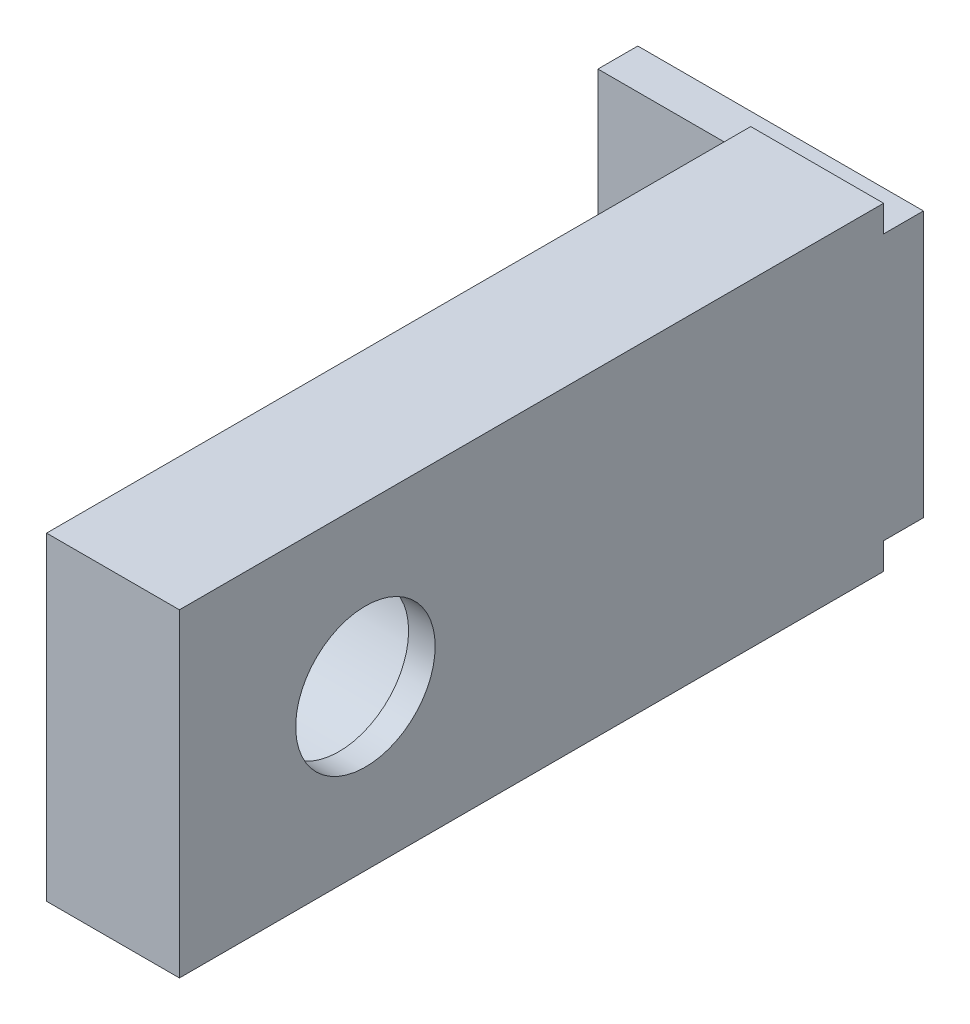
ISO-10303-21;
HEADER;
FILE_DESCRIPTION(('STEP AP214'),'2;1');
FILE_NAME('part.step','',(''),(''),'','','');
FILE_SCHEMA(('AUTOMOTIVE_DESIGN { 1 0 10303 214 1 1 1 1 }'));
ENDSEC;
DATA;
#1=APPLICATION_CONTEXT('core data for automotive mechanical design processes');
#2=APPLICATION_PROTOCOL_DEFINITION('international standard','automotive_design',2000,#1);
#3=PRODUCT_CONTEXT('',#1,'mechanical');
#4=PRODUCT('Part','Part','',(#3));
#5=PRODUCT_RELATED_PRODUCT_CATEGORY('part','',(#4));
#6=PRODUCT_DEFINITION_FORMATION('','',#4);
#7=PRODUCT_DEFINITION_CONTEXT('part definition',#1,'design');
#8=PRODUCT_DEFINITION('design','',#6,#7);
#9=PRODUCT_DEFINITION_SHAPE('','',#8);
#10=(LENGTH_UNIT() NAMED_UNIT(*) SI_UNIT(.MILLI.,.METRE.));
#11=(NAMED_UNIT(*) PLANE_ANGLE_UNIT() SI_UNIT($,.RADIAN.));
#12=(NAMED_UNIT(*) SI_UNIT($,.STERADIAN.) SOLID_ANGLE_UNIT());
#13=UNCERTAINTY_MEASURE_WITH_UNIT(LENGTH_MEASURE(1.E-05),#10,'distance_accuracy_value','');
#14=(GEOMETRIC_REPRESENTATION_CONTEXT(3) GLOBAL_UNCERTAINTY_ASSIGNED_CONTEXT((#13)) GLOBAL_UNIT_ASSIGNED_CONTEXT((#10,
#11,#12)) REPRESENTATION_CONTEXT('',''));
#15=CARTESIAN_POINT('',(0.,0.,0.));
#16=DIRECTION('',(0.,0.,1.));
#17=DIRECTION('',(1.,0.,0.));
#18=AXIS2_PLACEMENT_3D('',#15,#16,#17);
#19=CARTESIAN_POINT('',(31.,44.,64.0019));
#20=DIRECTION('',(1.,0.,0.));
#21=DIRECTION('',(0.,0.,-1.));
#22=AXIS2_PLACEMENT_3D('',#19,#20,#21);
#23=PLANE('',#22);
#24=CARTESIAN_POINT('',(31.,44.,64.0019));
#25=DIRECTION('',(1.,0.,0.));
#26=DIRECTION('',(0.,0.,-1.));
#27=AXIS2_PLACEMENT_3D('',#24,#25,#26);
#28=CIRCLE('',#27,1.5);
#29=CARTESIAN_POINT('',(31.,44.,62.5019));
#30=VERTEX_POINT('',#29);
#31=EDGE_CURVE('E153',#30,#30,#28,.F.);
#32=ORIENTED_EDGE('',*,*,#31,.T.);
#33=EDGE_LOOP('',(#32));
#34=FACE_BOUND('',#33,.T.);
#35=ADVANCED_FACE('F15',(#34),#23,.F.);
#36=CARTESIAN_POINT('',(31.,44.,104.0019));
#37=DIRECTION('',(1.,0.,0.));
#38=DIRECTION('',(0.,0.,-1.));
#39=AXIS2_PLACEMENT_3D('',#36,#37,#38);
#40=PLANE('',#39);
#41=CARTESIAN_POINT('',(31.,44.,104.0019));
#42=DIRECTION('',(1.,0.,0.));
#43=DIRECTION('',(0.,0.,-1.));
#44=AXIS2_PLACEMENT_3D('',#41,#42,#43);
#45=CIRCLE('',#44,1.5);
#46=CARTESIAN_POINT('',(31.,44.,102.5019));
#47=VERTEX_POINT('',#46);
#48=EDGE_CURVE('E150',#47,#47,#45,.F.);
#49=ORIENTED_EDGE('',*,*,#48,.T.);
#50=EDGE_LOOP('',(#49));
#51=FACE_BOUND('',#50,.T.);
#52=ADVANCED_FACE('F391',(#51),#40,.F.);
#53=CARTESIAN_POINT('',(31.,4.,64.0019));
#54=DIRECTION('',(1.,0.,0.));
#55=DIRECTION('',(0.,0.,-1.));
#56=AXIS2_PLACEMENT_3D('',#53,#54,#55);
#57=PLANE('',#56);
#58=CARTESIAN_POINT('',(31.,4.,64.0019));
#59=DIRECTION('',(1.,0.,0.));
#60=DIRECTION('',(0.,0.,-1.));
#61=AXIS2_PLACEMENT_3D('',#58,#59,#60);
#62=CIRCLE('',#61,1.5);
#63=CARTESIAN_POINT('',(31.,4.,62.5019));
#64=VERTEX_POINT('',#63);
#65=EDGE_CURVE('E147',#64,#64,#62,.F.);
#66=ORIENTED_EDGE('',*,*,#65,.T.);
#67=EDGE_LOOP('',(#66));
#68=FACE_BOUND('',#67,.T.);
#69=ADVANCED_FACE('F176',(#68),#57,.F.);
#70=CARTESIAN_POINT('',(31.,4.,104.0019));
#71=DIRECTION('',(1.,0.,0.));
#72=DIRECTION('',(0.,0.,-1.));
#73=AXIS2_PLACEMENT_3D('',#70,#71,#72);
#74=PLANE('',#73);
#75=CARTESIAN_POINT('',(31.,4.,104.0019));
#76=DIRECTION('',(1.,0.,0.));
#77=DIRECTION('',(0.,0.,-1.));
#78=AXIS2_PLACEMENT_3D('',#75,#76,#77);
#79=CIRCLE('',#78,1.5);
#80=CARTESIAN_POINT('',(31.,4.,102.5019));
#81=VERTEX_POINT('',#80);
#82=EDGE_CURVE('E95',#81,#81,#79,.F.);
#83=ORIENTED_EDGE('',*,*,#82,.T.);
#84=EDGE_LOOP('',(#83));
#85=FACE_BOUND('',#84,.T.);
#86=ADVANCED_FACE('F166',(#85),#74,.F.);
#87=CARTESIAN_POINT('',(8.,24.,0.001899999999978));
#88=DIRECTION('',(0.,0.,1.));
#89=DIRECTION('',(1.,0.,0.));
#90=AXIS2_PLACEMENT_3D('',#87,#88,#89);
#91=CYLINDRICAL_SURFACE('',#90,2.75);
#92=CARTESIAN_POINT('',(8.,24.,0.001899999999978));
#93=DIRECTION('',(0.,0.,1.));
#94=DIRECTION('',(1.,0.,0.));
#95=AXIS2_PLACEMENT_3D('',#92,#93,#94);
#96=CIRCLE('',#95,2.75);
#97=CARTESIAN_POINT('',(10.75,24.,0.001899999999978));
#98=VERTEX_POINT('',#97);
#99=EDGE_CURVE('E142',#98,#98,#96,.F.);
#100=ORIENTED_EDGE('',*,*,#99,.T.);
#101=EDGE_LOOP('',(#100));
#102=FACE_BOUND('',#101,.T.);
#103=CARTESIAN_POINT('',(8.,24.,6.0019));
#104=DIRECTION('',(0.,0.,1.));
#105=DIRECTION('',(1.,0.,0.));
#106=AXIS2_PLACEMENT_3D('',#103,#104,#105);
#107=CIRCLE('',#106,2.75);
#108=CARTESIAN_POINT('',(10.75,24.,6.0019));
#109=VERTEX_POINT('',#108);
#110=EDGE_CURVE('E18',#109,#109,#107,.F.);
#111=ORIENTED_EDGE('',*,*,#110,.F.);
#112=EDGE_LOOP('',(#111));
#113=FACE_BOUND('',#112,.T.);
#114=ADVANCED_FACE('F163',(#102,#113),#91,.F.);
#115=CARTESIAN_POINT('',(18.,24.,0.001899999999978));
#116=DIRECTION('',(0.,0.,1.));
#117=DIRECTION('',(1.,0.,0.));
#118=AXIS2_PLACEMENT_3D('',#115,#116,#117);
#119=CYLINDRICAL_SURFACE('',#118,2.75);
#120=CARTESIAN_POINT('',(18.,24.,0.001899999999978));
#121=DIRECTION('',(0.,0.,1.));
#122=DIRECTION('',(1.,0.,0.));
#123=AXIS2_PLACEMENT_3D('',#120,#121,#122);
#124=CIRCLE('',#123,2.75);
#125=CARTESIAN_POINT('',(20.75,24.,0.001899999999978));
#126=VERTEX_POINT('',#125);
#127=EDGE_CURVE('E138',#126,#126,#124,.F.);
#128=ORIENTED_EDGE('',*,*,#127,.T.);
#129=EDGE_LOOP('',(#128));
#130=FACE_BOUND('',#129,.T.);
#131=CARTESIAN_POINT('',(18.,24.,6.0019));
#132=DIRECTION('',(0.,0.,1.));
#133=DIRECTION('',(1.,0.,0.));
#134=AXIS2_PLACEMENT_3D('',#131,#132,#133);
#135=CIRCLE('',#134,2.75);
#136=CARTESIAN_POINT('',(20.75,24.,6.0019));
#137=VERTEX_POINT('',#136);
#138=EDGE_CURVE('E155',#137,#137,#135,.F.);
#139=ORIENTED_EDGE('',*,*,#138,.F.);
#140=EDGE_LOOP('',(#139));
#141=FACE_BOUND('',#140,.T.);
#142=ADVANCED_FACE('F165',(#130,#141),#119,.F.);
#143=CARTESIAN_POINT('',(0.,4.,0.001899999999978));
#144=DIRECTION('',(1.,0.,0.));
#145=DIRECTION('',(0.,0.,-1.));
#146=AXIS2_PLACEMENT_3D('',#143,#144,#145);
#147=PLANE('',#146);
#148=DIRECTION('',(0.,0.,1.));
#149=VECTOR('',#148,1.);
#150=CARTESIAN_POINT('',(0.,44.,0.001899999999978));
#151=LINE('',#150,#149);
#152=CARTESIAN_POINT('',(0.,44.,0.001899999999978));
#153=VERTEX_POINT('',#152);
#154=CARTESIAN_POINT('',(0.,44.,6.0019));
#155=VERTEX_POINT('',#154);
#156=EDGE_CURVE('E457',#153,#155,#151,.T.);
#157=ORIENTED_EDGE('',*,*,#156,.F.);
#158=DIRECTION('',(0.,1.,0.));
#159=VECTOR('',#158,1.);
#160=CARTESIAN_POINT('',(0.,4.,0.001899999999978));
#161=LINE('',#160,#159);
#162=CARTESIAN_POINT('',(0.,4.,0.001899999999978));
#163=VERTEX_POINT('',#162);
#164=EDGE_CURVE('E84',#153,#163,#161,.F.);
#165=ORIENTED_EDGE('',*,*,#164,.T.);
#166=DIRECTION('',(0.,0.,1.));
#167=VECTOR('',#166,1.);
#168=CARTESIAN_POINT('',(0.,4.,0.001899999999978));
#169=LINE('',#168,#167);
#170=CARTESIAN_POINT('',(0.,4.,6.0019));
#171=VERTEX_POINT('',#170);
#172=EDGE_CURVE('E86',#163,#171,#169,.T.);
#173=ORIENTED_EDGE('',*,*,#172,.T.);
#174=DIRECTION('',(0.,1.,0.));
#175=VECTOR('',#174,1.);
#176=CARTESIAN_POINT('',(0.,4.,6.0019));
#177=LINE('',#176,#175);
#178=EDGE_CURVE('E89',#155,#171,#177,.F.);
#179=ORIENTED_EDGE('',*,*,#178,.F.);
#180=EDGE_LOOP('',(#157,#165,#173,#179));
#181=FACE_BOUND('',#180,.T.);
#182=ADVANCED_FACE('F88',(#181),#147,.F.);
#183=CARTESIAN_POINT('',(0.,4.,6.0019));
#184=DIRECTION('',(0.,0.,1.));
#185=DIRECTION('',(1.,0.,0.));
#186=AXIS2_PLACEMENT_3D('',#183,#184,#185);
#187=PLANE('',#186);
#188=ORIENTED_EDGE('',*,*,#138,.T.);
#189=EDGE_LOOP('',(#188));
#190=FACE_BOUND('',#189,.T.);
#191=ORIENTED_EDGE('',*,*,#110,.T.);
#192=EDGE_LOOP('',(#191));
#193=FACE_BOUND('',#192,.T.);
#194=DIRECTION('',(1.,0.,0.));
#195=VECTOR('',#194,1.);
#196=CARTESIAN_POINT('',(0.,4.,6.0019));
#197=LINE('',#196,#195);
#198=CARTESIAN_POINT('',(23.,4.,6.0019));
#199=VERTEX_POINT('',#198);
#200=EDGE_CURVE('E94',#171,#199,#197,.T.);
#201=ORIENTED_EDGE('',*,*,#200,.T.);
#202=DIRECTION('',(0.,1.,0.));
#203=VECTOR('',#202,1.);
#204=CARTESIAN_POINT('',(23.,0.,6.0019));
#205=LINE('',#204,#203);
#206=CARTESIAN_POINT('',(23.,44.,6.0019));
#207=VERTEX_POINT('',#206);
#208=EDGE_CURVE('E137',#199,#207,#205,.T.);
#209=ORIENTED_EDGE('',*,*,#208,.T.);
#210=DIRECTION('',(1.,0.,0.));
#211=VECTOR('',#210,1.);
#212=CARTESIAN_POINT('',(0.,44.,6.0019));
#213=LINE('',#212,#211);
#214=EDGE_CURVE('E101',#155,#207,#213,.T.);
#215=ORIENTED_EDGE('',*,*,#214,.F.);
#216=ORIENTED_EDGE('',*,*,#178,.T.);
#217=EDGE_LOOP('',(#201,#209,#215,#216));
#218=FACE_BOUND('',#217,.T.);
#219=ADVANCED_FACE('F98',(#190,#193,#218),#187,.T.);
#220=CARTESIAN_POINT('',(23.,44.,64.0019));
#221=DIRECTION('',(1.,0.,0.));
#222=DIRECTION('',(0.,0.,-1.));
#223=AXIS2_PLACEMENT_3D('',#220,#221,#222);
#224=CYLINDRICAL_SURFACE('',#223,1.5);
#225=CARTESIAN_POINT('',(23.,44.,64.0019));
#226=DIRECTION('',(1.,0.,0.));
#227=DIRECTION('',(0.,0.,-1.));
#228=AXIS2_PLACEMENT_3D('',#225,#226,#227);
#229=CIRCLE('',#228,1.5);
#230=CARTESIAN_POINT('',(23.,44.,62.5019));
#231=VERTEX_POINT('',#230);
#232=EDGE_CURVE('E134',#231,#231,#229,.F.);
#233=ORIENTED_EDGE('',*,*,#232,.T.);
#234=EDGE_LOOP('',(#233));
#235=FACE_BOUND('',#234,.T.);
#236=ORIENTED_EDGE('',*,*,#31,.F.);
#237=EDGE_LOOP('',(#236));
#238=FACE_BOUND('',#237,.T.);
#239=ADVANCED_FACE('F243',(#235,#238),#224,.F.);
#240=CARTESIAN_POINT('',(23.,44.,104.0019));
#241=DIRECTION('',(1.,0.,0.));
#242=DIRECTION('',(0.,0.,-1.));
#243=AXIS2_PLACEMENT_3D('',#240,#241,#242);
#244=CYLINDRICAL_SURFACE('',#243,1.5);
#245=CARTESIAN_POINT('',(23.,44.,104.0019));
#246=DIRECTION('',(1.,0.,0.));
#247=DIRECTION('',(0.,0.,-1.));
#248=AXIS2_PLACEMENT_3D('',#245,#246,#247);
#249=CIRCLE('',#248,1.5);
#250=CARTESIAN_POINT('',(23.,44.,102.5019));
#251=VERTEX_POINT('',#250);
#252=EDGE_CURVE('E131',#251,#251,#249,.F.);
#253=ORIENTED_EDGE('',*,*,#252,.T.);
#254=EDGE_LOOP('',(#253));
#255=FACE_BOUND('',#254,.T.);
#256=ORIENTED_EDGE('',*,*,#48,.F.);
#257=EDGE_LOOP('',(#256));
#258=FACE_BOUND('',#257,.T.);
#259=ADVANCED_FACE('F239',(#255,#258),#244,.F.);
#260=CARTESIAN_POINT('',(23.,4.,64.0019));
#261=DIRECTION('',(1.,0.,0.));
#262=DIRECTION('',(0.,0.,-1.));
#263=AXIS2_PLACEMENT_3D('',#260,#261,#262);
#264=CYLINDRICAL_SURFACE('',#263,1.5);
#265=CARTESIAN_POINT('',(23.,4.,64.0019));
#266=DIRECTION('',(1.,0.,0.));
#267=DIRECTION('',(0.,0.,-1.));
#268=AXIS2_PLACEMENT_3D('',#265,#266,#267);
#269=CIRCLE('',#268,1.5);
#270=CARTESIAN_POINT('',(23.,4.,62.5019));
#271=VERTEX_POINT('',#270);
#272=EDGE_CURVE('E128',#271,#271,#269,.F.);
#273=ORIENTED_EDGE('',*,*,#272,.T.);
#274=EDGE_LOOP('',(#273));
#275=FACE_BOUND('',#274,.T.);
#276=ORIENTED_EDGE('',*,*,#65,.F.);
#277=EDGE_LOOP('',(#276));
#278=FACE_BOUND('',#277,.T.);
#279=ADVANCED_FACE('F235',(#275,#278),#264,.F.);
#280=CARTESIAN_POINT('',(23.,4.,104.0019));
#281=DIRECTION('',(1.,0.,0.));
#282=DIRECTION('',(0.,0.,-1.));
#283=AXIS2_PLACEMENT_3D('',#280,#281,#282);
#284=CYLINDRICAL_SURFACE('',#283,1.5);
#285=CARTESIAN_POINT('',(23.,4.,104.0019));
#286=DIRECTION('',(1.,0.,0.));
#287=DIRECTION('',(0.,0.,-1.));
#288=AXIS2_PLACEMENT_3D('',#285,#286,#287);
#289=CIRCLE('',#288,1.5);
#290=CARTESIAN_POINT('',(23.,4.,102.5019));
#291=VERTEX_POINT('',#290);
#292=EDGE_CURVE('E122',#291,#291,#289,.F.);
#293=ORIENTED_EDGE('',*,*,#292,.T.);
#294=EDGE_LOOP('',(#293));
#295=FACE_BOUND('',#294,.T.);
#296=ORIENTED_EDGE('',*,*,#82,.F.);
#297=EDGE_LOOP('',(#296));
#298=FACE_BOUND('',#297,.T.);
#299=ADVANCED_FACE('F231',(#295,#298),#284,.F.);
#300=CARTESIAN_POINT('',(23.,24.,84.0019));
#301=DIRECTION('',(1.,0.,0.));
#302=DIRECTION('',(0.,0.,-1.));
#303=AXIS2_PLACEMENT_3D('',#300,#301,#302);
#304=CYLINDRICAL_SURFACE('',#303,17.5);
#305=CARTESIAN_POINT('',(23.,24.,84.0019));
#306=DIRECTION('',(1.,0.,0.));
#307=DIRECTION('',(0.,0.,-1.));
#308=AXIS2_PLACEMENT_3D('',#305,#306,#307);
#309=CIRCLE('',#308,17.5);
#310=CARTESIAN_POINT('',(23.,24.,66.5019));
#311=VERTEX_POINT('',#310);
#312=EDGE_CURVE('E125',#311,#311,#309,.F.);
#313=ORIENTED_EDGE('',*,*,#312,.T.);
#314=EDGE_LOOP('',(#313));
#315=FACE_BOUND('',#314,.T.);
#316=CARTESIAN_POINT('',(39.,24.,84.0019));
#317=DIRECTION('',(1.,0.,0.));
#318=DIRECTION('',(0.,0.,-1.));
#319=AXIS2_PLACEMENT_3D('',#316,#317,#318);
#320=CIRCLE('',#319,17.5);
#321=CARTESIAN_POINT('',(39.,24.,66.5019));
#322=VERTEX_POINT('',#321);
#323=EDGE_CURVE('E118',#322,#322,#320,.T.);
#324=ORIENTED_EDGE('',*,*,#323,.T.);
#325=EDGE_LOOP('',(#324));
#326=FACE_BOUND('',#325,.T.);
#327=ADVANCED_FACE('F228',(#315,#326),#304,.F.);
#328=CARTESIAN_POINT('',(0.,4.,0.001899999999978));
#329=DIRECTION('',(0.,1.,0.));
#330=DIRECTION('',(0.,0.,1.));
#331=AXIS2_PLACEMENT_3D('',#328,#329,#330);
#332=PLANE('',#331);
#333=DIRECTION('',(1.,0.,0.));
#334=VECTOR('',#333,1.);
#335=CARTESIAN_POINT('',(23.,4.,6.0019));
#336=LINE('',#335,#334);
#337=CARTESIAN_POINT('',(43.,4.,6.0019));
#338=VERTEX_POINT('',#337);
#339=EDGE_CURVE('E107',#338,#199,#336,.F.);
#340=ORIENTED_EDGE('',*,*,#339,.T.);
#341=ORIENTED_EDGE('',*,*,#200,.F.);
#342=ORIENTED_EDGE('',*,*,#172,.F.);
#343=DIRECTION('',(1.,0.,0.));
#344=VECTOR('',#343,1.);
#345=CARTESIAN_POINT('',(0.,4.,0.001899999999978));
#346=LINE('',#345,#344);
#347=CARTESIAN_POINT('',(43.,4.,0.001899999999978));
#348=VERTEX_POINT('',#347);
#349=EDGE_CURVE('E110',#163,#348,#346,.T.);
#350=ORIENTED_EDGE('',*,*,#349,.T.);
#351=DIRECTION('',(0.,0.,-1.));
#352=VECTOR('',#351,1.);
#353=CARTESIAN_POINT('',(43.,4.,0.001899999999978));
#354=LINE('',#353,#352);
#355=EDGE_CURVE('E446',#338,#348,#354,.T.);
#356=ORIENTED_EDGE('',*,*,#355,.F.);
#357=EDGE_LOOP('',(#340,#341,#342,#350,#356));
#358=FACE_BOUND('',#357,.T.);
#359=ADVANCED_FACE('F105',(#358),#332,.F.);
#360=CARTESIAN_POINT('',(0.,4.,0.001899999999978));
#361=DIRECTION('',(0.,0.,1.));
#362=DIRECTION('',(1.,0.,0.));
#363=AXIS2_PLACEMENT_3D('',#360,#361,#362);
#364=PLANE('',#363);
#365=ORIENTED_EDGE('',*,*,#127,.F.);
#366=EDGE_LOOP('',(#365));
#367=FACE_BOUND('',#366,.T.);
#368=ORIENTED_EDGE('',*,*,#99,.F.);
#369=EDGE_LOOP('',(#368));
#370=FACE_BOUND('',#369,.T.);
#371=DIRECTION('',(0.,1.,0.));
#372=VECTOR('',#371,1.);
#373=CARTESIAN_POINT('',(43.,4.,0.001899999999978));
#374=LINE('',#373,#372);
#375=CARTESIAN_POINT('',(43.,44.,0.001899999999978));
#376=VERTEX_POINT('',#375);
#377=EDGE_CURVE('E443',#348,#376,#374,.T.);
#378=ORIENTED_EDGE('',*,*,#377,.F.);
#379=ORIENTED_EDGE('',*,*,#349,.F.);
#380=ORIENTED_EDGE('',*,*,#164,.F.);
#381=DIRECTION('',(1.,0.,0.));
#382=VECTOR('',#381,1.);
#383=CARTESIAN_POINT('',(0.,44.,0.001899999999978));
#384=LINE('',#383,#382);
#385=EDGE_CURVE('E141',#376,#153,#384,.F.);
#386=ORIENTED_EDGE('',*,*,#385,.F.);
#387=EDGE_LOOP('',(#378,#379,#380,#386));
#388=FACE_BOUND('',#387,.T.);
#389=ADVANCED_FACE('F221',(#367,#370,#388),#364,.F.);
#390=CARTESIAN_POINT('',(0.,44.,0.001899999999978));
#391=DIRECTION('',(0.,1.,0.));
#392=DIRECTION('',(0.,0.,1.));
#393=AXIS2_PLACEMENT_3D('',#390,#391,#392);
#394=PLANE('',#393);
#395=DIRECTION('',(1.,0.,0.));
#396=VECTOR('',#395,1.);
#397=CARTESIAN_POINT('',(23.,44.,6.0019));
#398=LINE('',#397,#396);
#399=CARTESIAN_POINT('',(43.,44.,6.0019));
#400=VERTEX_POINT('',#399);
#401=EDGE_CURVE('E434',#207,#400,#398,.T.);
#402=ORIENTED_EDGE('',*,*,#401,.T.);
#403=DIRECTION('',(0.,0.,-1.));
#404=VECTOR('',#403,1.);
#405=CARTESIAN_POINT('',(43.,44.,0.001899999999978));
#406=LINE('',#405,#404);
#407=EDGE_CURVE('E440',#376,#400,#406,.F.);
#408=ORIENTED_EDGE('',*,*,#407,.F.);
#409=ORIENTED_EDGE('',*,*,#385,.T.);
#410=ORIENTED_EDGE('',*,*,#156,.T.);
#411=ORIENTED_EDGE('',*,*,#214,.T.);
#412=EDGE_LOOP('',(#402,#408,#409,#410,#411));
#413=FACE_BOUND('',#412,.T.);
#414=ADVANCED_FACE('F217',(#413),#394,.T.);
#415=CARTESIAN_POINT('',(23.,0.,6.0019));
#416=DIRECTION('',(1.,0.,0.));
#417=DIRECTION('',(0.,0.,-1.));
#418=AXIS2_PLACEMENT_3D('',#415,#416,#417);
#419=PLANE('',#418);
#420=ORIENTED_EDGE('',*,*,#292,.F.);
#421=EDGE_LOOP('',(#420));
#422=FACE_BOUND('',#421,.T.);
#423=ORIENTED_EDGE('',*,*,#312,.F.);
#424=EDGE_LOOP('',(#423));
#425=FACE_BOUND('',#424,.T.);
#426=ORIENTED_EDGE('',*,*,#272,.F.);
#427=EDGE_LOOP('',(#426));
#428=FACE_BOUND('',#427,.T.);
#429=ORIENTED_EDGE('',*,*,#252,.F.);
#430=EDGE_LOOP('',(#429));
#431=FACE_BOUND('',#430,.T.);
#432=ORIENTED_EDGE('',*,*,#232,.F.);
#433=EDGE_LOOP('',(#432));
#434=FACE_BOUND('',#433,.T.);
#435=DIRECTION('',(0.,0.,1.));
#436=VECTOR('',#435,1.);
#437=CARTESIAN_POINT('',(23.,48.,6.0019));
#438=LINE('',#437,#436);
#439=CARTESIAN_POINT('',(23.,48.,6.0019));
#440=VERTEX_POINT('',#439);
#441=CARTESIAN_POINT('',(23.,48.,112.0019));
#442=VERTEX_POINT('',#441);
#443=EDGE_CURVE('E423',#440,#442,#438,.T.);
#444=ORIENTED_EDGE('',*,*,#443,.F.);
#445=DIRECTION('',(0.,1.,0.));
#446=VECTOR('',#445,1.);
#447=CARTESIAN_POINT('',(23.,0.,6.0019));
#448=LINE('',#447,#446);
#449=EDGE_CURVE('E425',#440,#207,#448,.F.);
#450=ORIENTED_EDGE('',*,*,#449,.T.);
#451=ORIENTED_EDGE('',*,*,#208,.F.);
#452=DIRECTION('',(0.,1.,0.));
#453=VECTOR('',#452,1.);
#454=CARTESIAN_POINT('',(23.,0.,6.0019));
#455=LINE('',#454,#453);
#456=CARTESIAN_POINT('',(23.,0.,6.0019));
#457=VERTEX_POINT('',#456);
#458=EDGE_CURVE('E452',#199,#457,#455,.F.);
#459=ORIENTED_EDGE('',*,*,#458,.T.);
#460=DIRECTION('',(0.,0.,1.));
#461=VECTOR('',#460,1.);
#462=CARTESIAN_POINT('',(23.,0.,6.0019));
#463=LINE('',#462,#461);
#464=CARTESIAN_POINT('',(23.,0.,112.0019));
#465=VERTEX_POINT('',#464);
#466=EDGE_CURVE('E121',#457,#465,#463,.T.);
#467=ORIENTED_EDGE('',*,*,#466,.T.);
#468=DIRECTION('',(0.,1.,0.));
#469=VECTOR('',#468,1.);
#470=CARTESIAN_POINT('',(23.,0.,112.0019));
#471=LINE('',#470,#469);
#472=EDGE_CURVE('E427',#442,#465,#471,.F.);
#473=ORIENTED_EDGE('',*,*,#472,.F.);
#474=EDGE_LOOP('',(#444,#450,#451,#459,#467,#473));
#475=FACE_BOUND('',#474,.T.);
#476=ADVANCED_FACE('F213',(#422,#425,#428,#431,#434,#475),#419,.F.);
#477=CARTESIAN_POINT('',(39.,24.,84.0019));
#478=DIRECTION('',(1.,0.,0.));
#479=DIRECTION('',(0.,0.,-1.));
#480=AXIS2_PLACEMENT_3D('',#477,#478,#479);
#481=PLANE('',#480);
#482=CARTESIAN_POINT('',(39.,24.,84.0019));
#483=DIRECTION('',(1.,0.,0.));
#484=DIRECTION('',(0.,0.,-1.));
#485=AXIS2_PLACEMENT_3D('',#482,#483,#484);
#486=CIRCLE('',#485,10.5);
#487=CARTESIAN_POINT('',(39.,24.,73.5019));
#488=VERTEX_POINT('',#487);
#489=EDGE_CURVE('E114',#488,#488,#486,.T.);
#490=ORIENTED_EDGE('',*,*,#489,.T.);
#491=EDGE_LOOP('',(#490));
#492=FACE_BOUND('',#491,.T.);
#493=ORIENTED_EDGE('',*,*,#323,.F.);
#494=EDGE_LOOP('',(#493));
#495=FACE_BOUND('',#494,.T.);
#496=ADVANCED_FACE('F209',(#492,#495),#481,.F.);
#497=CARTESIAN_POINT('',(23.,0.,6.0019));
#498=DIRECTION('',(0.,1.,0.));
#499=DIRECTION('',(0.,0.,1.));
#500=AXIS2_PLACEMENT_3D('',#497,#498,#499);
#501=PLANE('',#500);
#502=DIRECTION('',(1.,0.,0.));
#503=VECTOR('',#502,1.);
#504=CARTESIAN_POINT('',(23.,0.,112.0019));
#505=LINE('',#504,#503);
#506=CARTESIAN_POINT('',(43.,0.,112.0019));
#507=VERTEX_POINT('',#506);
#508=EDGE_CURVE('E476',#465,#507,#505,.T.);
#509=ORIENTED_EDGE('',*,*,#508,.F.);
#510=ORIENTED_EDGE('',*,*,#466,.F.);
#511=DIRECTION('',(1.,0.,0.));
#512=VECTOR('',#511,1.);
#513=CARTESIAN_POINT('',(23.,0.,6.0019));
#514=LINE('',#513,#512);
#515=CARTESIAN_POINT('',(43.,0.,6.0019));
#516=VERTEX_POINT('',#515);
#517=EDGE_CURVE('E450',#457,#516,#514,.T.);
#518=ORIENTED_EDGE('',*,*,#517,.T.);
#519=DIRECTION('',(0.,0.,-1.));
#520=VECTOR('',#519,1.);
#521=CARTESIAN_POINT('',(43.,0.,6.0019));
#522=LINE('',#521,#520);
#523=EDGE_CURVE('E117',#507,#516,#522,.T.);
#524=ORIENTED_EDGE('',*,*,#523,.F.);
#525=EDGE_LOOP('',(#509,#510,#518,#524));
#526=FACE_BOUND('',#525,.T.);
#527=ADVANCED_FACE('F205',(#526),#501,.F.);
#528=CARTESIAN_POINT('',(23.,0.,6.0019));
#529=DIRECTION('',(0.,0.,1.));
#530=DIRECTION('',(1.,0.,0.));
#531=AXIS2_PLACEMENT_3D('',#528,#529,#530);
#532=PLANE('',#531);
#533=DIRECTION('',(0.,1.,0.));
#534=VECTOR('',#533,1.);
#535=CARTESIAN_POINT('',(43.,0.,6.0019));
#536=LINE('',#535,#534);
#537=EDGE_CURVE('E466',#516,#338,#536,.T.);
#538=ORIENTED_EDGE('',*,*,#537,.F.);
#539=ORIENTED_EDGE('',*,*,#517,.F.);
#540=ORIENTED_EDGE('',*,*,#458,.F.);
#541=ORIENTED_EDGE('',*,*,#339,.F.);
#542=EDGE_LOOP('',(#538,#539,#540,#541));
#543=FACE_BOUND('',#542,.T.);
#544=ADVANCED_FACE('F201',(#543),#532,.F.);
#545=CARTESIAN_POINT('',(23.,0.,6.0019));
#546=DIRECTION('',(0.,0.,1.));
#547=DIRECTION('',(1.,0.,0.));
#548=AXIS2_PLACEMENT_3D('',#545,#546,#547);
#549=PLANE('',#548);
#550=DIRECTION('',(0.,1.,0.));
#551=VECTOR('',#550,1.);
#552=CARTESIAN_POINT('',(43.,0.,6.0019));
#553=LINE('',#552,#551);
#554=CARTESIAN_POINT('',(43.,48.,6.0019));
#555=VERTEX_POINT('',#554);
#556=EDGE_CURVE('E469',#400,#555,#553,.T.);
#557=ORIENTED_EDGE('',*,*,#556,.F.);
#558=ORIENTED_EDGE('',*,*,#401,.F.);
#559=ORIENTED_EDGE('',*,*,#449,.F.);
#560=DIRECTION('',(1.,0.,0.));
#561=VECTOR('',#560,1.);
#562=CARTESIAN_POINT('',(23.,48.,6.0019));
#563=LINE('',#562,#561);
#564=EDGE_CURVE('E428',#555,#440,#563,.F.);
#565=ORIENTED_EDGE('',*,*,#564,.F.);
#566=EDGE_LOOP('',(#557,#558,#559,#565));
#567=FACE_BOUND('',#566,.T.);
#568=ADVANCED_FACE('F198',(#567),#549,.F.);
#569=CARTESIAN_POINT('',(23.,48.,6.0019));
#570=DIRECTION('',(0.,1.,0.));
#571=DIRECTION('',(0.,0.,1.));
#572=AXIS2_PLACEMENT_3D('',#569,#570,#571);
#573=PLANE('',#572);
#574=DIRECTION('',(1.,0.,0.));
#575=VECTOR('',#574,1.);
#576=CARTESIAN_POINT('',(23.,48.,112.0019));
#577=LINE('',#576,#575);
#578=CARTESIAN_POINT('',(43.,48.,112.0019));
#579=VERTEX_POINT('',#578);
#580=EDGE_CURVE('E33',#579,#442,#577,.F.);
#581=ORIENTED_EDGE('',*,*,#580,.F.);
#582=DIRECTION('',(0.,0.,-1.));
#583=VECTOR('',#582,1.);
#584=CARTESIAN_POINT('',(43.,48.,6.0019));
#585=LINE('',#584,#583);
#586=EDGE_CURVE('E431',#555,#579,#585,.F.);
#587=ORIENTED_EDGE('',*,*,#586,.F.);
#588=ORIENTED_EDGE('',*,*,#564,.T.);
#589=ORIENTED_EDGE('',*,*,#443,.T.);
#590=EDGE_LOOP('',(#581,#587,#588,#589));
#591=FACE_BOUND('',#590,.T.);
#592=ADVANCED_FACE('F194',(#591),#573,.T.);
#593=CARTESIAN_POINT('',(23.,0.,112.0019));
#594=DIRECTION('',(0.,0.,1.));
#595=DIRECTION('',(1.,0.,0.));
#596=AXIS2_PLACEMENT_3D('',#593,#594,#595);
#597=PLANE('',#596);
#598=DIRECTION('',(0.,1.,0.));
#599=VECTOR('',#598,1.);
#600=CARTESIAN_POINT('',(43.,0.,112.0019));
#601=LINE('',#600,#599);
#602=EDGE_CURVE('E24',#579,#507,#601,.F.);
#603=ORIENTED_EDGE('',*,*,#602,.F.);
#604=ORIENTED_EDGE('',*,*,#580,.T.);
#605=ORIENTED_EDGE('',*,*,#472,.T.);
#606=ORIENTED_EDGE('',*,*,#508,.T.);
#607=EDGE_LOOP('',(#603,#604,#605,#606));
#608=FACE_BOUND('',#607,.T.);
#609=ADVANCED_FACE('F187',(#608),#597,.T.);
#610=CARTESIAN_POINT('',(23.,24.,84.0019));
#611=DIRECTION('',(1.,0.,0.));
#612=DIRECTION('',(0.,0.,-1.));
#613=AXIS2_PLACEMENT_3D('',#610,#611,#612);
#614=CYLINDRICAL_SURFACE('',#613,10.5);
#615=CARTESIAN_POINT('',(43.,24.,84.0019));
#616=DIRECTION('',(1.,0.,0.));
#617=DIRECTION('',(0.,0.,-1.));
#618=AXIS2_PLACEMENT_3D('',#615,#616,#617);
#619=CIRCLE('',#618,10.5);
#620=CARTESIAN_POINT('',(43.,24.,73.5019));
#621=VERTEX_POINT('',#620);
#622=EDGE_CURVE('E9',#621,#621,#619,.F.);
#623=ORIENTED_EDGE('',*,*,#622,.F.);
#624=EDGE_LOOP('',(#623));
#625=FACE_BOUND('',#624,.T.);
#626=ORIENTED_EDGE('',*,*,#489,.F.);
#627=EDGE_LOOP('',(#626));
#628=FACE_BOUND('',#627,.T.);
#629=ADVANCED_FACE('F181',(#625,#628),#614,.F.);
#630=CARTESIAN_POINT('',(43.,0.,6.0019));
#631=DIRECTION('',(1.,0.,0.));
#632=DIRECTION('',(0.,0.,-1.));
#633=AXIS2_PLACEMENT_3D('',#630,#631,#632);
#634=PLANE('',#633);
#635=ORIENTED_EDGE('',*,*,#622,.T.);
#636=EDGE_LOOP('',(#635));
#637=FACE_BOUND('',#636,.T.);
#638=ORIENTED_EDGE('',*,*,#586,.T.);
#639=ORIENTED_EDGE('',*,*,#602,.T.);
#640=ORIENTED_EDGE('',*,*,#523,.T.);
#641=ORIENTED_EDGE('',*,*,#537,.T.);
#642=ORIENTED_EDGE('',*,*,#355,.T.);
#643=ORIENTED_EDGE('',*,*,#377,.T.);
#644=ORIENTED_EDGE('',*,*,#407,.T.);
#645=ORIENTED_EDGE('',*,*,#556,.T.);
#646=EDGE_LOOP('',(#638,#639,#640,#641,#642,#643,#644,#645));
#647=FACE_BOUND('',#646,.T.);
#648=ADVANCED_FACE('F179',(#637,#647),#634,.T.);
#649=CLOSED_SHELL('',(#35,#52,#69,#86,#114,#142,#182,#219,#239,#259,#279,#299,#327,#359,#389,
#414,#476,#496,#527,#544,#568,#592,#609,#629,#648));
#650=MANIFOLD_SOLID_BREP('B1',#649);
#651=ADVANCED_BREP_SHAPE_REPRESENTATION('',(#18,#650),#14);
#652=SHAPE_DEFINITION_REPRESENTATION(#9,#651);
ENDSEC;
END-ISO-10303-21;
